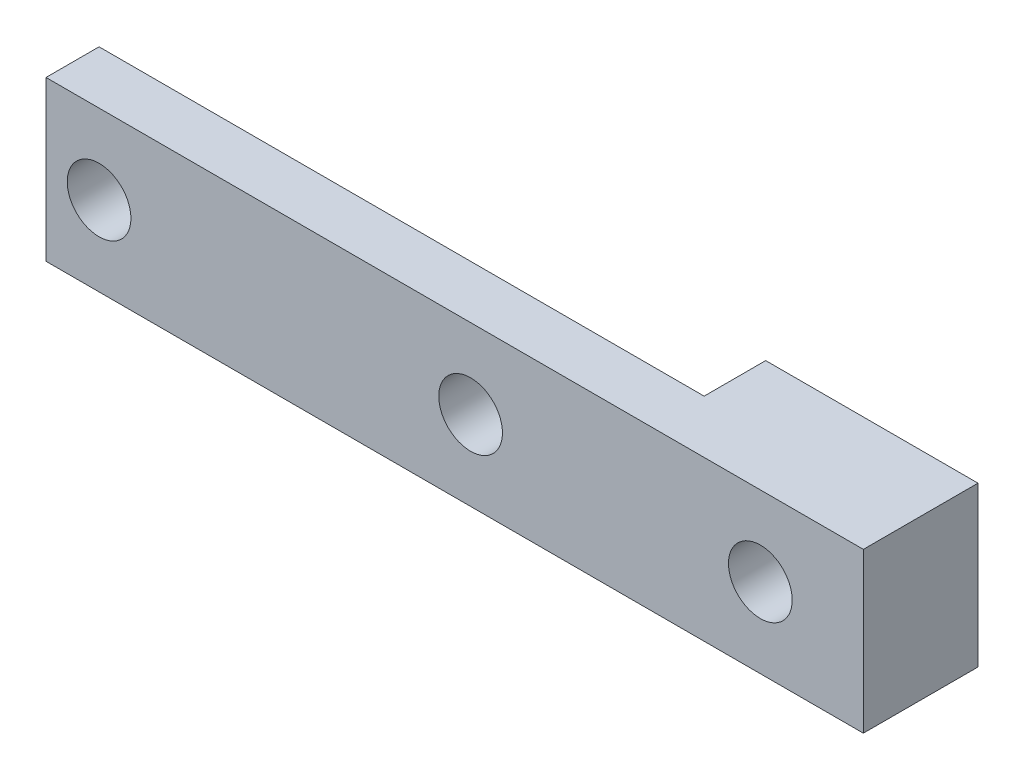
ISO-10303-21;
HEADER;
FILE_DESCRIPTION(('STEP AP214'),'2;1');
FILE_NAME('part.step','',(''),(''),'','','');
FILE_SCHEMA(('AUTOMOTIVE_DESIGN { 1 0 10303 214 1 1 1 1 }'));
ENDSEC;
DATA;
#1=APPLICATION_CONTEXT('core data for automotive mechanical design processes');
#2=APPLICATION_PROTOCOL_DEFINITION('international standard','automotive_design',2000,#1);
#3=PRODUCT_CONTEXT('',#1,'mechanical');
#4=PRODUCT('Part','Part','',(#3));
#5=PRODUCT_RELATED_PRODUCT_CATEGORY('part','',(#4));
#6=PRODUCT_DEFINITION_FORMATION('','',#4);
#7=PRODUCT_DEFINITION_CONTEXT('part definition',#1,'design');
#8=PRODUCT_DEFINITION('design','',#6,#7);
#9=PRODUCT_DEFINITION_SHAPE('','',#8);
#10=(LENGTH_UNIT() NAMED_UNIT(*) SI_UNIT(.MILLI.,.METRE.));
#11=(NAMED_UNIT(*) PLANE_ANGLE_UNIT() SI_UNIT($,.RADIAN.));
#12=(NAMED_UNIT(*) SI_UNIT($,.STERADIAN.) SOLID_ANGLE_UNIT());
#13=UNCERTAINTY_MEASURE_WITH_UNIT(LENGTH_MEASURE(1.E-05),#10,'distance_accuracy_value','');
#14=(GEOMETRIC_REPRESENTATION_CONTEXT(3) GLOBAL_UNCERTAINTY_ASSIGNED_CONTEXT((#13)) GLOBAL_UNIT_ASSIGNED_CONTEXT((#10,
#11,#12)) REPRESENTATION_CONTEXT('',''));
#15=CARTESIAN_POINT('',(0.,0.,0.));
#16=DIRECTION('',(0.,0.,1.));
#17=DIRECTION('',(1.,0.,0.));
#18=AXIS2_PLACEMENT_3D('',#15,#16,#17);
#19=CARTESIAN_POINT('',(0.,0.,0.));
#20=DIRECTION('',(0.,0.,1.));
#21=DIRECTION('',(1.,0.,0.));
#22=AXIS2_PLACEMENT_3D('',#19,#20,#21);
#23=PLANE('',#22);
#24=CARTESIAN_POINT('',(0.750000000000001,0.,0.));
#25=DIRECTION('',(0.,0.,1.));
#26=DIRECTION('',(1.,0.,0.));
#27=AXIS2_PLACEMENT_3D('',#24,#25,#26);
#28=CIRCLE('',#27,1.5);
#29=CARTESIAN_POINT('',(2.25,0.,0.));
#30=VERTEX_POINT('',#29);
#31=EDGE_CURVE('E135',#30,#30,#28,.T.);
#32=ORIENTED_EDGE('',*,*,#31,.T.);
#33=EDGE_LOOP('',(#32));
#34=FACE_BOUND('',#33,.T.);
#35=CARTESIAN_POINT('',(-16.75,0.,0.));
#36=DIRECTION('',(0.,0.,1.));
#37=DIRECTION('',(1.,0.,0.));
#38=AXIS2_PLACEMENT_3D('',#35,#36,#37);
#39=CIRCLE('',#38,1.5);
#40=CARTESIAN_POINT('',(-15.25,0.,0.));
#41=VERTEX_POINT('',#40);
#42=EDGE_CURVE('E123',#41,#41,#39,.T.);
#43=ORIENTED_EDGE('',*,*,#42,.T.);
#44=EDGE_LOOP('',(#43));
#45=FACE_BOUND('',#44,.T.);
#46=DIRECTION('',(0.,1.,0.));
#47=VECTOR('',#46,1.);
#48=CARTESIAN_POINT('',(9.25,-3.75,0.));
#49=LINE('',#48,#47);
#50=CARTESIAN_POINT('',(9.25,-3.75,0.));
#51=VERTEX_POINT('',#50);
#52=CARTESIAN_POINT('',(9.25,3.75,0.));
#53=VERTEX_POINT('',#52);
#54=EDGE_CURVE('E58',#51,#53,#49,.T.);
#55=ORIENTED_EDGE('',*,*,#54,.F.);
#56=DIRECTION('',(-1.,0.,0.));
#57=VECTOR('',#56,1.);
#58=CARTESIAN_POINT('',(0.,-3.75,0.));
#59=LINE('',#58,#57);
#60=CARTESIAN_POINT('',(-19.25,-3.75,0.));
#61=VERTEX_POINT('',#60);
#62=EDGE_CURVE('E80',#51,#61,#59,.T.);
#63=ORIENTED_EDGE('',*,*,#62,.T.);
#64=DIRECTION('',(0.,1.,0.));
#65=VECTOR('',#64,1.);
#66=CARTESIAN_POINT('',(-19.25,0.,0.));
#67=LINE('',#66,#65);
#68=CARTESIAN_POINT('',(-19.25,3.75,0.));
#69=VERTEX_POINT('',#68);
#70=EDGE_CURVE('E150',#61,#69,#67,.T.);
#71=ORIENTED_EDGE('',*,*,#70,.T.);
#72=DIRECTION('',(-1.,0.,0.));
#73=VECTOR('',#72,1.);
#74=CARTESIAN_POINT('',(0.,3.75,0.));
#75=LINE('',#74,#73);
#76=EDGE_CURVE('E126',#53,#69,#75,.T.);
#77=ORIENTED_EDGE('',*,*,#76,.F.);
#78=EDGE_LOOP('',(#55,#63,#71,#77));
#79=FACE_BOUND('',#78,.T.);
#80=ADVANCED_FACE('F43',(#34,#45,#79),#23,.F.);
#81=CARTESIAN_POINT('',(19.25,0.,2.5));
#82=DIRECTION('',(-1.,0.,0.));
#83=DIRECTION('',(0.,0.,1.));
#84=AXIS2_PLACEMENT_3D('',#81,#82,#83);
#85=PLANE('',#84);
#86=DIRECTION('',(0.,0.,-1.));
#87=VECTOR('',#86,1.);
#88=CARTESIAN_POINT('',(19.25,-3.75,2.5));
#89=LINE('',#88,#87);
#90=CARTESIAN_POINT('',(19.25,-3.75,2.5));
#91=VERTEX_POINT('',#90);
#92=CARTESIAN_POINT('',(19.25,-3.75,-2.9));
#93=VERTEX_POINT('',#92);
#94=EDGE_CURVE('E67',#91,#93,#89,.T.);
#95=ORIENTED_EDGE('',*,*,#94,.T.);
#96=DIRECTION('',(0.,-1.,0.));
#97=VECTOR('',#96,1.);
#98=CARTESIAN_POINT('',(19.25,-3.75,-2.9));
#99=LINE('',#98,#97);
#100=CARTESIAN_POINT('',(19.25,3.75,-2.9));
#101=VERTEX_POINT('',#100);
#102=EDGE_CURVE('E120',#101,#93,#99,.T.);
#103=ORIENTED_EDGE('',*,*,#102,.F.);
#104=DIRECTION('',(0.,0.,-1.));
#105=VECTOR('',#104,1.);
#106=CARTESIAN_POINT('',(19.25,3.75,2.5));
#107=LINE('',#106,#105);
#108=CARTESIAN_POINT('',(19.25,3.75,2.5));
#109=VERTEX_POINT('',#108);
#110=EDGE_CURVE('E11',#109,#101,#107,.T.);
#111=ORIENTED_EDGE('',*,*,#110,.F.);
#112=DIRECTION('',(0.,1.,0.));
#113=VECTOR('',#112,1.);
#114=CARTESIAN_POINT('',(19.25,0.,2.5));
#115=LINE('',#114,#113);
#116=EDGE_CURVE('E134',#91,#109,#115,.T.);
#117=ORIENTED_EDGE('',*,*,#116,.F.);
#118=EDGE_LOOP('',(#95,#103,#111,#117));
#119=FACE_BOUND('',#118,.T.);
#120=ADVANCED_FACE('F185',(#119),#85,.F.);
#121=CARTESIAN_POINT('',(0.,3.75,2.5));
#122=DIRECTION('',(0.,-1.,0.));
#123=DIRECTION('',(0.,0.,-1.));
#124=AXIS2_PLACEMENT_3D('',#121,#122,#123);
#125=PLANE('',#124);
#126=ORIENTED_EDGE('',*,*,#110,.T.);
#127=DIRECTION('',(1.,0.,0.));
#128=VECTOR('',#127,1.);
#129=CARTESIAN_POINT('',(19.25,3.75,-2.9));
#130=LINE('',#129,#128);
#131=CARTESIAN_POINT('',(9.25,3.75,-2.9));
#132=VERTEX_POINT('',#131);
#133=EDGE_CURVE('E113',#132,#101,#130,.T.);
#134=ORIENTED_EDGE('',*,*,#133,.F.);
#135=DIRECTION('',(0.,0.,1.));
#136=VECTOR('',#135,1.);
#137=CARTESIAN_POINT('',(9.25,3.75,-2.9));
#138=LINE('',#137,#136);
#139=EDGE_CURVE('E109',#132,#53,#138,.T.);
#140=ORIENTED_EDGE('',*,*,#139,.T.);
#141=ORIENTED_EDGE('',*,*,#76,.T.);
#142=DIRECTION('',(0.,0.,-1.));
#143=VECTOR('',#142,1.);
#144=CARTESIAN_POINT('',(-19.25,3.75,2.5));
#145=LINE('',#144,#143);
#146=CARTESIAN_POINT('',(-19.25,3.75,2.5));
#147=VERTEX_POINT('',#146);
#148=EDGE_CURVE('E51',#147,#69,#145,.T.);
#149=ORIENTED_EDGE('',*,*,#148,.F.);
#150=DIRECTION('',(-1.,0.,0.));
#151=VECTOR('',#150,1.);
#152=CARTESIAN_POINT('',(0.,3.75,2.5));
#153=LINE('',#152,#151);
#154=EDGE_CURVE('E87',#109,#147,#153,.T.);
#155=ORIENTED_EDGE('',*,*,#154,.F.);
#156=EDGE_LOOP('',(#126,#134,#140,#141,#149,#155));
#157=FACE_BOUND('',#156,.T.);
#158=ADVANCED_FACE('F163',(#157),#125,.F.);
#159=CARTESIAN_POINT('',(-19.25,0.,2.5));
#160=DIRECTION('',(-1.,0.,0.));
#161=DIRECTION('',(0.,0.,1.));
#162=AXIS2_PLACEMENT_3D('',#159,#160,#161);
#163=PLANE('',#162);
#164=ORIENTED_EDGE('',*,*,#70,.F.);
#165=DIRECTION('',(0.,0.,-1.));
#166=VECTOR('',#165,1.);
#167=CARTESIAN_POINT('',(-19.25,-3.75,2.5));
#168=LINE('',#167,#166);
#169=CARTESIAN_POINT('',(-19.25,-3.75,2.5));
#170=VERTEX_POINT('',#169);
#171=EDGE_CURVE('E156',#170,#61,#168,.T.);
#172=ORIENTED_EDGE('',*,*,#171,.F.);
#173=DIRECTION('',(0.,1.,0.));
#174=VECTOR('',#173,1.);
#175=CARTESIAN_POINT('',(-19.25,0.,2.5));
#176=LINE('',#175,#174);
#177=EDGE_CURVE('E138',#170,#147,#176,.T.);
#178=ORIENTED_EDGE('',*,*,#177,.T.);
#179=ORIENTED_EDGE('',*,*,#148,.T.);
#180=EDGE_LOOP('',(#164,#172,#178,#179));
#181=FACE_BOUND('',#180,.T.);
#182=ADVANCED_FACE('F160',(#181),#163,.T.);
#183=CARTESIAN_POINT('',(14.398,0.,2.5));
#184=DIRECTION('',(0.,0.,-1.));
#185=DIRECTION('',(-1.,0.,0.));
#186=AXIS2_PLACEMENT_3D('',#183,#184,#185);
#187=CYLINDRICAL_SURFACE('',#186,1.5);
#188=CARTESIAN_POINT('',(14.398,0.,2.5));
#189=DIRECTION('',(0.,0.,1.));
#190=DIRECTION('',(1.,0.,0.));
#191=AXIS2_PLACEMENT_3D('',#188,#189,#190);
#192=CIRCLE('',#191,1.5);
#193=CARTESIAN_POINT('',(15.898,0.,2.5));
#194=VERTEX_POINT('',#193);
#195=EDGE_CURVE('E143',#194,#194,#192,.T.);
#196=ORIENTED_EDGE('',*,*,#195,.T.);
#197=EDGE_LOOP('',(#196));
#198=FACE_BOUND('',#197,.T.);
#199=CARTESIAN_POINT('',(14.398,0.,-2.9));
#200=DIRECTION('',(0.,0.,-1.));
#201=DIRECTION('',(-1.,0.,0.));
#202=AXIS2_PLACEMENT_3D('',#199,#200,#201);
#203=CIRCLE('',#202,1.5);
#204=CARTESIAN_POINT('',(12.898,0.,-2.9));
#205=VERTEX_POINT('',#204);
#206=EDGE_CURVE('E162',#205,#205,#203,.T.);
#207=ORIENTED_EDGE('',*,*,#206,.T.);
#208=EDGE_LOOP('',(#207));
#209=FACE_BOUND('',#208,.T.);
#210=ADVANCED_FACE('F171',(#198,#209),#187,.F.);
#211=CARTESIAN_POINT('',(0.,-3.75,2.5));
#212=DIRECTION('',(0.,-1.,0.));
#213=DIRECTION('',(0.,0.,-1.));
#214=AXIS2_PLACEMENT_3D('',#211,#212,#213);
#215=PLANE('',#214);
#216=ORIENTED_EDGE('',*,*,#62,.F.);
#217=DIRECTION('',(0.,0.,1.));
#218=VECTOR('',#217,1.);
#219=CARTESIAN_POINT('',(9.25,-3.75,-2.9));
#220=LINE('',#219,#218);
#221=CARTESIAN_POINT('',(9.25,-3.75,-2.9));
#222=VERTEX_POINT('',#221);
#223=EDGE_CURVE('E107',#222,#51,#220,.T.);
#224=ORIENTED_EDGE('',*,*,#223,.F.);
#225=DIRECTION('',(-1.,0.,0.));
#226=VECTOR('',#225,1.);
#227=CARTESIAN_POINT('',(9.25,-3.75,-2.9));
#228=LINE('',#227,#226);
#229=EDGE_CURVE('E114',#93,#222,#228,.T.);
#230=ORIENTED_EDGE('',*,*,#229,.F.);
#231=ORIENTED_EDGE('',*,*,#94,.F.);
#232=DIRECTION('',(-1.,0.,0.));
#233=VECTOR('',#232,1.);
#234=CARTESIAN_POINT('',(0.,-3.75,2.5));
#235=LINE('',#234,#233);
#236=EDGE_CURVE('E141',#91,#170,#235,.T.);
#237=ORIENTED_EDGE('',*,*,#236,.T.);
#238=ORIENTED_EDGE('',*,*,#171,.T.);
#239=EDGE_LOOP('',(#216,#224,#230,#231,#237,#238));
#240=FACE_BOUND('',#239,.T.);
#241=ADVANCED_FACE('F122',(#240),#215,.T.);
#242=CARTESIAN_POINT('',(-16.75,0.,2.5));
#243=DIRECTION('',(0.,0.,-1.));
#244=DIRECTION('',(-1.,0.,0.));
#245=AXIS2_PLACEMENT_3D('',#242,#243,#244);
#246=CYLINDRICAL_SURFACE('',#245,1.5);
#247=CARTESIAN_POINT('',(-16.75,0.,2.5));
#248=DIRECTION('',(0.,0.,1.));
#249=DIRECTION('',(1.,0.,0.));
#250=AXIS2_PLACEMENT_3D('',#247,#248,#249);
#251=CIRCLE('',#250,1.5);
#252=CARTESIAN_POINT('',(-15.25,0.,2.5));
#253=VERTEX_POINT('',#252);
#254=EDGE_CURVE('E131',#253,#253,#251,.T.);
#255=ORIENTED_EDGE('',*,*,#254,.T.);
#256=EDGE_LOOP('',(#255));
#257=FACE_BOUND('',#256,.T.);
#258=ORIENTED_EDGE('',*,*,#42,.F.);
#259=EDGE_LOOP('',(#258));
#260=FACE_BOUND('',#259,.T.);
#261=ADVANCED_FACE('F45',(#257,#260),#246,.F.);
#262=CARTESIAN_POINT('',(0.750000000000001,0.,2.5));
#263=DIRECTION('',(0.,0.,-1.));
#264=DIRECTION('',(-1.,0.,0.));
#265=AXIS2_PLACEMENT_3D('',#262,#263,#264);
#266=CYLINDRICAL_SURFACE('',#265,1.5);
#267=CARTESIAN_POINT('',(0.750000000000001,0.,2.5));
#268=DIRECTION('',(0.,0.,1.));
#269=DIRECTION('',(1.,0.,0.));
#270=AXIS2_PLACEMENT_3D('',#267,#268,#269);
#271=CIRCLE('',#270,1.5);
#272=CARTESIAN_POINT('',(2.25,0.,2.5));
#273=VERTEX_POINT('',#272);
#274=EDGE_CURVE('E146',#273,#273,#271,.T.);
#275=ORIENTED_EDGE('',*,*,#274,.T.);
#276=EDGE_LOOP('',(#275));
#277=FACE_BOUND('',#276,.T.);
#278=ORIENTED_EDGE('',*,*,#31,.F.);
#279=EDGE_LOOP('',(#278));
#280=FACE_BOUND('',#279,.T.);
#281=ADVANCED_FACE('F181',(#277,#280),#266,.F.);
#282=CARTESIAN_POINT('',(0.,0.,2.5));
#283=DIRECTION('',(0.,0.,1.));
#284=DIRECTION('',(1.,0.,0.));
#285=AXIS2_PLACEMENT_3D('',#282,#283,#284);
#286=PLANE('',#285);
#287=ORIENTED_EDGE('',*,*,#254,.F.);
#288=EDGE_LOOP('',(#287));
#289=FACE_BOUND('',#288,.T.);
#290=ORIENTED_EDGE('',*,*,#116,.T.);
#291=ORIENTED_EDGE('',*,*,#154,.T.);
#292=ORIENTED_EDGE('',*,*,#177,.F.);
#293=ORIENTED_EDGE('',*,*,#236,.F.);
#294=EDGE_LOOP('',(#290,#291,#292,#293));
#295=FACE_BOUND('',#294,.T.);
#296=ORIENTED_EDGE('',*,*,#195,.F.);
#297=EDGE_LOOP('',(#296));
#298=FACE_BOUND('',#297,.T.);
#299=ORIENTED_EDGE('',*,*,#274,.F.);
#300=EDGE_LOOP('',(#299));
#301=FACE_BOUND('',#300,.T.);
#302=ADVANCED_FACE('F173',(#289,#295,#298,#301),#286,.T.);
#303=CARTESIAN_POINT('',(0.,0.,-2.9));
#304=DIRECTION('',(0.,0.,1.));
#305=DIRECTION('',(1.,0.,0.));
#306=AXIS2_PLACEMENT_3D('',#303,#304,#305);
#307=PLANE('',#306);
#308=ORIENTED_EDGE('',*,*,#229,.T.);
#309=DIRECTION('',(0.,1.,0.));
#310=VECTOR('',#309,1.);
#311=CARTESIAN_POINT('',(9.25,-3.75,-2.9));
#312=LINE('',#311,#310);
#313=EDGE_CURVE('E103',#222,#132,#312,.T.);
#314=ORIENTED_EDGE('',*,*,#313,.T.);
#315=ORIENTED_EDGE('',*,*,#133,.T.);
#316=ORIENTED_EDGE('',*,*,#102,.T.);
#317=EDGE_LOOP('',(#308,#314,#315,#316));
#318=FACE_BOUND('',#317,.T.);
#319=ORIENTED_EDGE('',*,*,#206,.F.);
#320=EDGE_LOOP('',(#319));
#321=FACE_BOUND('',#320,.T.);
#322=ADVANCED_FACE('F117',(#318,#321),#307,.F.);
#323=CARTESIAN_POINT('',(9.25,-3.75,-2.9));
#324=DIRECTION('',(1.,0.,0.));
#325=DIRECTION('',(0.,1.,0.));
#326=AXIS2_PLACEMENT_3D('',#323,#324,#325);
#327=PLANE('',#326);
#328=ORIENTED_EDGE('',*,*,#54,.T.);
#329=ORIENTED_EDGE('',*,*,#139,.F.);
#330=ORIENTED_EDGE('',*,*,#313,.F.);
#331=ORIENTED_EDGE('',*,*,#223,.T.);
#332=EDGE_LOOP('',(#328,#329,#330,#331));
#333=FACE_BOUND('',#332,.T.);
#334=ADVANCED_FACE('F105',(#333),#327,.F.);
#335=CLOSED_SHELL('',(#80,#120,#158,#182,#210,#241,#261,#281,#302,#322,#334));
#336=MANIFOLD_SOLID_BREP('B2',#335);
#337=ADVANCED_BREP_SHAPE_REPRESENTATION('',(#18,#336),#14);
#338=SHAPE_DEFINITION_REPRESENTATION(#9,#337);
ENDSEC;
END-ISO-10303-21;
